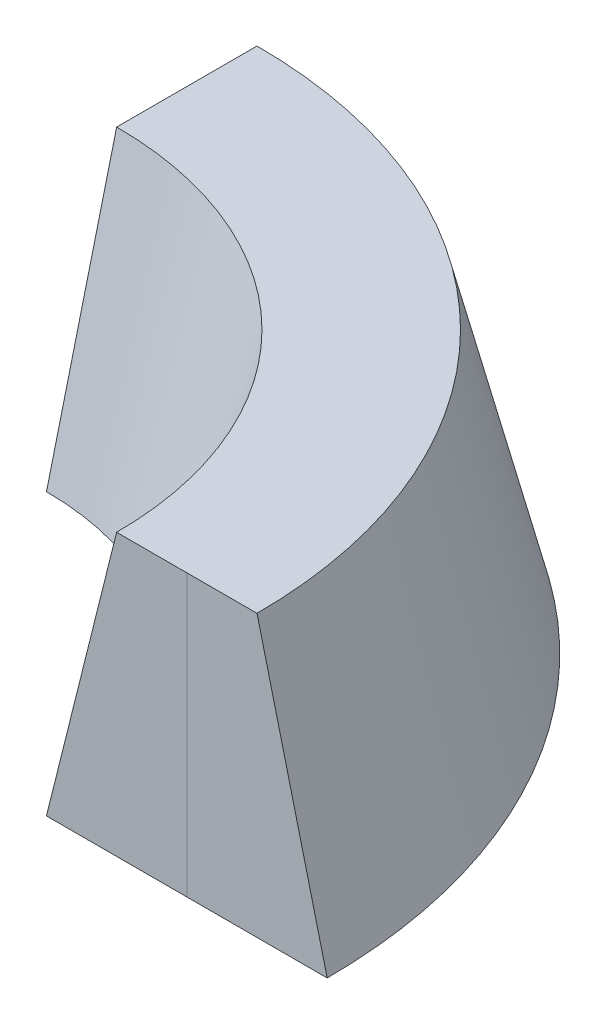
ISO-10303-21;
HEADER;
FILE_DESCRIPTION(('STEP AP214'),'2;1');
FILE_NAME('part.step','',(''),(''),'','','');
FILE_SCHEMA(('AUTOMOTIVE_DESIGN { 1 0 10303 214 1 1 1 1 }'));
ENDSEC;
DATA;
#1=APPLICATION_CONTEXT('core data for automotive mechanical design processes');
#2=APPLICATION_PROTOCOL_DEFINITION('international standard','automotive_design',2000,#1);
#3=PRODUCT_CONTEXT('',#1,'mechanical');
#4=PRODUCT('Part','Part','',(#3));
#5=PRODUCT_RELATED_PRODUCT_CATEGORY('part','',(#4));
#6=PRODUCT_DEFINITION_FORMATION('','',#4);
#7=PRODUCT_DEFINITION_CONTEXT('part definition',#1,'design');
#8=PRODUCT_DEFINITION('design','',#6,#7);
#9=PRODUCT_DEFINITION_SHAPE('','',#8);
#10=(LENGTH_UNIT() NAMED_UNIT(*) SI_UNIT(.MILLI.,.METRE.));
#11=(NAMED_UNIT(*) PLANE_ANGLE_UNIT() SI_UNIT($,.RADIAN.));
#12=(NAMED_UNIT(*) SI_UNIT($,.STERADIAN.) SOLID_ANGLE_UNIT());
#13=UNCERTAINTY_MEASURE_WITH_UNIT(LENGTH_MEASURE(1.E-05),#10,'distance_accuracy_value','');
#14=(GEOMETRIC_REPRESENTATION_CONTEXT(3) GLOBAL_UNCERTAINTY_ASSIGNED_CONTEXT((#13)) GLOBAL_UNIT_ASSIGNED_CONTEXT((#10,
#11,#12)) REPRESENTATION_CONTEXT('',''));
#15=CARTESIAN_POINT('',(0.,0.,0.));
#16=DIRECTION('',(0.,0.,1.));
#17=DIRECTION('',(1.,0.,0.));
#18=AXIS2_PLACEMENT_3D('',#15,#16,#17);
#19=CARTESIAN_POINT('',(4000.,0.,0.));
#20=DIRECTION('',(0.,0.,1.));
#21=DIRECTION('',(1.,0.,0.));
#22=AXIS2_PLACEMENT_3D('',#19,#20,#21);
#23=PLANE('',#22);
#24=DIRECTION('',(-1.,0.,0.));
#25=VECTOR('',#24,1.);
#26=CARTESIAN_POINT('',(7000.,4000.,0.));
#27=LINE('',#26,#25);
#28=CARTESIAN_POINT('',(7000.,4000.,0.));
#29=VERTEX_POINT('',#28);
#30=CARTESIAN_POINT('',(6000.,4000.,0.));
#31=VERTEX_POINT('',#30);
#32=EDGE_CURVE('E107',#29,#31,#27,.T.);
#33=ORIENTED_EDGE('',*,*,#32,.T.);
#34=DIRECTION('',(0.,-1.,0.));
#35=VECTOR('',#34,1.);
#36=CARTESIAN_POINT('',(6000.,4.44089209850063E-13,0.));
#37=LINE('',#36,#35);
#38=CARTESIAN_POINT('',(6000.,0.,0.));
#39=VERTEX_POINT('',#38);
#40=EDGE_CURVE('E11',#31,#39,#37,.T.);
#41=ORIENTED_EDGE('',*,*,#40,.T.);
#42=DIRECTION('',(1.,0.,0.));
#43=VECTOR('',#42,1.);
#44=CARTESIAN_POINT('',(4000.,0.,0.));
#45=LINE('',#44,#43);
#46=CARTESIAN_POINT('',(8000.,0.,0.));
#47=VERTEX_POINT('',#46);
#48=EDGE_CURVE('E99',#39,#47,#45,.T.);
#49=ORIENTED_EDGE('',*,*,#48,.T.);
#50=DIRECTION('',(-0.242535625036333,0.970142500145332,0.));
#51=VECTOR('',#50,1.);
#52=CARTESIAN_POINT('',(8000.,0.,0.));
#53=LINE('',#52,#51);
#54=EDGE_CURVE('E102',#47,#29,#53,.T.);
#55=ORIENTED_EDGE('',*,*,#54,.T.);
#56=EDGE_LOOP('',(#33,#41,#49,#55));
#57=FACE_BOUND('',#56,.T.);
#58=ADVANCED_FACE('F40',(#57),#23,.T.);
#59=CARTESIAN_POINT('',(0.,4000.,0.));
#60=DIRECTION('',(0.,1.,0.));
#61=DIRECTION('',(0.,0.,1.));
#62=AXIS2_PLACEMENT_3D('',#59,#60,#61);
#63=CONICAL_SURFACE('',#62,5000.,0.244978663126864);
#64=CARTESIAN_POINT('',(0.,0.,0.));
#65=DIRECTION('',(0.,-1.,0.));
#66=DIRECTION('',(0.,0.,-1.));
#67=AXIS2_PLACEMENT_3D('',#64,#65,#66);
#68=CIRCLE('',#67,4000.);
#69=CARTESIAN_POINT('',(-1.39659253553725E-11,0.,-4000.));
#70=VERTEX_POINT('',#69);
#71=CARTESIAN_POINT('',(4000.,0.,0.));
#72=VERTEX_POINT('',#71);
#73=EDGE_CURVE('E49',#70,#72,#68,.T.);
#74=ORIENTED_EDGE('',*,*,#73,.T.);
#75=DIRECTION('',(-0.242535625036333,-0.970142500145332,0.));
#76=VECTOR('',#75,1.);
#77=CARTESIAN_POINT('',(5000.,4000.,0.));
#78=LINE('',#77,#76);
#79=CARTESIAN_POINT('',(5000.,4000.,0.));
#80=VERTEX_POINT('',#79);
#81=EDGE_CURVE('E87',#80,#72,#78,.T.);
#82=ORIENTED_EDGE('',*,*,#81,.F.);
#83=CARTESIAN_POINT('',(0.,4000.,0.));
#84=DIRECTION('',(0.,-1.,0.));
#85=DIRECTION('',(0.,0.,-1.));
#86=AXIS2_PLACEMENT_3D('',#83,#84,#85);
#87=CIRCLE('',#86,5000.);
#88=CARTESIAN_POINT('',(-1.74574066942157E-11,4000.,-5000.));
#89=VERTEX_POINT('',#88);
#90=EDGE_CURVE('E118',#89,#80,#87,.T.);
#91=ORIENTED_EDGE('',*,*,#90,.F.);
#92=DIRECTION('',(0.,-0.970142500145332,0.242535625036333));
#93=VECTOR('',#92,1.);
#94=CARTESIAN_POINT('',(-1.74574066942157E-11,4000.,-5000.));
#95=LINE('',#94,#93);
#96=EDGE_CURVE('E89',#89,#70,#95,.T.);
#97=ORIENTED_EDGE('',*,*,#96,.T.);
#98=EDGE_LOOP('',(#74,#82,#91,#97));
#99=FACE_BOUND('',#98,.T.);
#100=ADVANCED_FACE('F86',(#99),#63,.F.);
#101=CARTESIAN_POINT('',(-1.39659253553725E-11,0.,-4000.));
#102=DIRECTION('',(0.,-1.,0.));
#103=DIRECTION('',(0.,0.,-1.));
#104=AXIS2_PLACEMENT_3D('',#101,#102,#103);
#105=PLANE('',#104);
#106=CARTESIAN_POINT('',(0.,0.,0.));
#107=DIRECTION('',(0.,-1.,0.));
#108=DIRECTION('',(0.,0.,-1.));
#109=AXIS2_PLACEMENT_3D('',#106,#107,#108);
#110=CIRCLE('',#109,8000.);
#111=CARTESIAN_POINT('',(-2.79318507107451E-11,0.,-8000.));
#112=VERTEX_POINT('',#111);
#113=EDGE_CURVE('E94',#112,#47,#110,.T.);
#114=ORIENTED_EDGE('',*,*,#113,.T.);
#115=ORIENTED_EDGE('',*,*,#48,.F.);
#116=EDGE_CURVE('E96',#72,#39,#45,.T.);
#117=ORIENTED_EDGE('',*,*,#116,.F.);
#118=ORIENTED_EDGE('',*,*,#73,.F.);
#119=DIRECTION('',(0.,0.,-1.));
#120=VECTOR('',#119,1.);
#121=CARTESIAN_POINT('',(-1.39659253553725E-11,0.,-4000.));
#122=LINE('',#121,#120);
#123=EDGE_CURVE('E110',#70,#112,#122,.T.);
#124=ORIENTED_EDGE('',*,*,#123,.T.);
#125=EDGE_LOOP('',(#114,#115,#117,#118,#124));
#126=FACE_BOUND('',#125,.T.);
#127=ADVANCED_FACE('F42',(#126),#105,.T.);
#128=CARTESIAN_POINT('',(0.,0.,0.));
#129=DIRECTION('',(0.,-1.,0.));
#130=DIRECTION('',(0.,0.,-1.));
#131=AXIS2_PLACEMENT_3D('',#128,#129,#130);
#132=CONICAL_SURFACE('',#131,8000.,0.244978663126864);
#133=CARTESIAN_POINT('',(0.,4000.,0.));
#134=DIRECTION('',(0.,-1.,0.));
#135=DIRECTION('',(0.,0.,-1.));
#136=AXIS2_PLACEMENT_3D('',#133,#134,#135);
#137=CIRCLE('',#136,7000.);
#138=CARTESIAN_POINT('',(-2.44403693719019E-11,4000.,-7000.));
#139=VERTEX_POINT('',#138);
#140=EDGE_CURVE('E120',#139,#29,#137,.T.);
#141=ORIENTED_EDGE('',*,*,#140,.T.);
#142=ORIENTED_EDGE('',*,*,#54,.F.);
#143=ORIENTED_EDGE('',*,*,#113,.F.);
#144=DIRECTION('',(0.,0.970142500145332,0.242535625036333));
#145=VECTOR('',#144,1.);
#146=CARTESIAN_POINT('',(-2.79318507107451E-11,0.,-8000.));
#147=LINE('',#146,#145);
#148=EDGE_CURVE('E112',#112,#139,#147,.T.);
#149=ORIENTED_EDGE('',*,*,#148,.T.);
#150=EDGE_LOOP('',(#141,#142,#143,#149));
#151=FACE_BOUND('',#150,.T.);
#152=ADVANCED_FACE('F125',(#151),#132,.T.);
#153=CARTESIAN_POINT('',(-2.44403693719019E-11,4000.,-7000.));
#154=DIRECTION('',(0.,1.,0.));
#155=DIRECTION('',(0.,0.,1.));
#156=AXIS2_PLACEMENT_3D('',#153,#154,#155);
#157=PLANE('',#156);
#158=DIRECTION('',(0.,0.,1.));
#159=VECTOR('',#158,1.);
#160=CARTESIAN_POINT('',(-2.44403693719019E-11,4000.,-7000.));
#161=LINE('',#160,#159);
#162=EDGE_CURVE('E115',#139,#89,#161,.T.);
#163=ORIENTED_EDGE('',*,*,#162,.T.);
#164=ORIENTED_EDGE('',*,*,#90,.T.);
#165=EDGE_CURVE('E97',#31,#80,#27,.T.);
#166=ORIENTED_EDGE('',*,*,#165,.F.);
#167=ORIENTED_EDGE('',*,*,#32,.F.);
#168=ORIENTED_EDGE('',*,*,#140,.F.);
#169=EDGE_LOOP('',(#163,#164,#166,#167,#168));
#170=FACE_BOUND('',#169,.T.);
#171=ADVANCED_FACE('F128',(#170),#157,.T.);
#172=CARTESIAN_POINT('',(-1.39659253553725E-11,0.,-4000.));
#173=DIRECTION('',(1.,0.,0.));
#174=DIRECTION('',(0.,0.,-1.));
#175=AXIS2_PLACEMENT_3D('',#172,#173,#174);
#176=PLANE('',#175);
#177=ORIENTED_EDGE('',*,*,#96,.F.);
#178=ORIENTED_EDGE('',*,*,#162,.F.);
#179=ORIENTED_EDGE('',*,*,#148,.F.);
#180=ORIENTED_EDGE('',*,*,#123,.F.);
#181=EDGE_LOOP('',(#177,#178,#179,#180));
#182=FACE_BOUND('',#181,.T.);
#183=ADVANCED_FACE('F131',(#182),#176,.F.);
#184=ORIENTED_EDGE('',*,*,#40,.F.);
#185=ORIENTED_EDGE('',*,*,#165,.T.);
#186=ORIENTED_EDGE('',*,*,#81,.T.);
#187=ORIENTED_EDGE('',*,*,#116,.T.);
#188=EDGE_LOOP('',(#184,#185,#186,#187));
#189=FACE_BOUND('',#188,.T.);
#190=ADVANCED_FACE('F95',(#189),#23,.T.);
#191=CLOSED_SHELL('',(#58,#100,#127,#152,#171,#183,#190));
#192=MANIFOLD_SOLID_BREP('B2',#191);
#193=ADVANCED_BREP_SHAPE_REPRESENTATION('',(#18,#192),#14);
#194=SHAPE_DEFINITION_REPRESENTATION(#9,#193);
ENDSEC;
END-ISO-10303-21;
